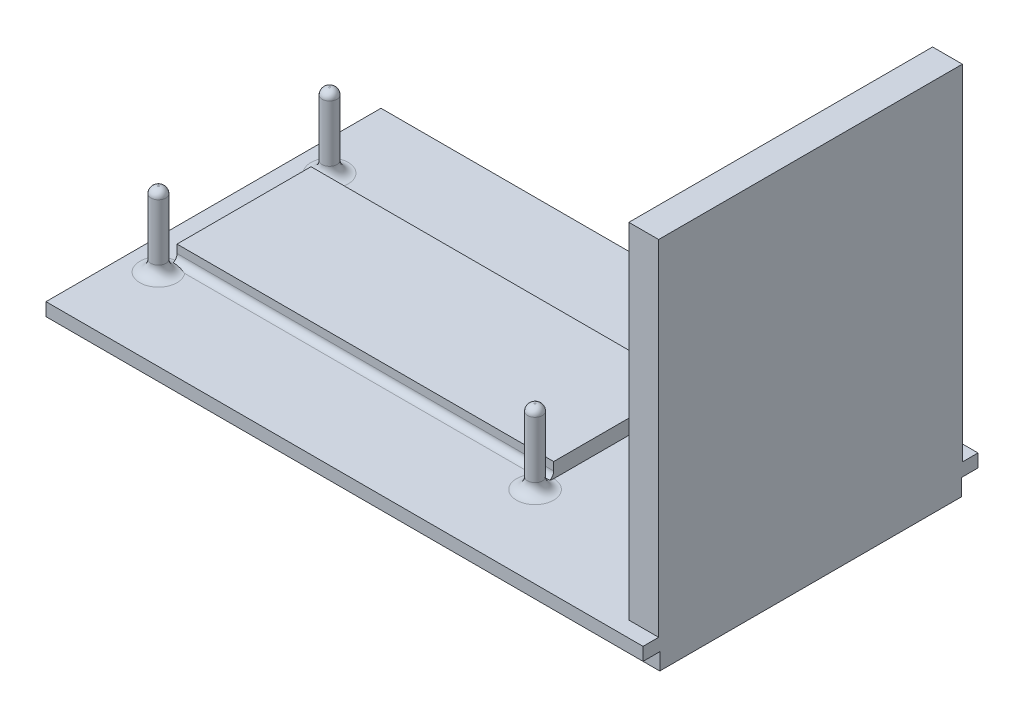
ISO-10303-21;
HEADER;
FILE_DESCRIPTION(('STEP AP214'),'2;1');
FILE_NAME('part.step','',(''),(''),'','','');
FILE_SCHEMA(('AUTOMOTIVE_DESIGN { 1 0 10303 214 1 1 1 1 }'));
ENDSEC;
DATA;
#1=APPLICATION_CONTEXT('core data for automotive mechanical design processes');
#2=APPLICATION_PROTOCOL_DEFINITION('international standard','automotive_design',2000,#1);
#3=PRODUCT_CONTEXT('',#1,'mechanical');
#4=PRODUCT('Part','Part','',(#3));
#5=PRODUCT_RELATED_PRODUCT_CATEGORY('part','',(#4));
#6=PRODUCT_DEFINITION_FORMATION('','',#4);
#7=PRODUCT_DEFINITION_CONTEXT('part definition',#1,'design');
#8=PRODUCT_DEFINITION('design','',#6,#7);
#9=PRODUCT_DEFINITION_SHAPE('','',#8);
#10=(LENGTH_UNIT() NAMED_UNIT(*) SI_UNIT(.MILLI.,.METRE.));
#11=(NAMED_UNIT(*) PLANE_ANGLE_UNIT() SI_UNIT($,.RADIAN.));
#12=(NAMED_UNIT(*) SI_UNIT($,.STERADIAN.) SOLID_ANGLE_UNIT());
#13=UNCERTAINTY_MEASURE_WITH_UNIT(LENGTH_MEASURE(1.E-05),#10,'distance_accuracy_value','');
#14=(GEOMETRIC_REPRESENTATION_CONTEXT(3) GLOBAL_UNCERTAINTY_ASSIGNED_CONTEXT((#13)) GLOBAL_UNIT_ASSIGNED_CONTEXT((#10,
#11,#12)) REPRESENTATION_CONTEXT('',''));
#15=CARTESIAN_POINT('',(0.,0.,0.));
#16=DIRECTION('',(0.,0.,1.));
#17=DIRECTION('',(1.,0.,0.));
#18=AXIS2_PLACEMENT_3D('',#15,#16,#17);
#19=CARTESIAN_POINT('',(80.2,3.99999999999999,0.));
#20=DIRECTION('',(0.,1.,0.));
#21=DIRECTION('',(0.,0.,1.));
#22=AXIS2_PLACEMENT_3D('',#19,#20,#21);
#23=PLANE('',#22);
#24=DIRECTION('',(1.,0.,0.));
#25=VECTOR('',#24,1.);
#26=CARTESIAN_POINT('',(76.2,4.,-2.1));
#27=LINE('',#26,#25);
#28=CARTESIAN_POINT('',(76.2,4.,-2.1));
#29=VERTEX_POINT('',#28);
#30=CARTESIAN_POINT('',(80.2,4.,-2.1));
#31=VERTEX_POINT('',#30);
#32=EDGE_CURVE('E243',#29,#31,#27,.T.);
#33=ORIENTED_EDGE('',*,*,#32,.F.);
#34=DIRECTION('',(0.,0.,-1.));
#35=VECTOR('',#34,1.);
#36=CARTESIAN_POINT('',(76.2,4.,-2.1));
#37=LINE('',#36,#35);
#38=CARTESIAN_POINT('',(76.2,3.99999999999999,-42.9));
#39=VERTEX_POINT('',#38);
#40=EDGE_CURVE('E237',#29,#39,#37,.T.);
#41=ORIENTED_EDGE('',*,*,#40,.T.);
#42=DIRECTION('',(1.,0.,0.));
#43=VECTOR('',#42,1.);
#44=CARTESIAN_POINT('',(76.2,3.99999999999999,-42.9));
#45=LINE('',#44,#43);
#46=CARTESIAN_POINT('',(80.2,4.,-42.9));
#47=VERTEX_POINT('',#46);
#48=EDGE_CURVE('E247',#39,#47,#45,.T.);
#49=ORIENTED_EDGE('',*,*,#48,.T.);
#50=DIRECTION('',(0.,0.,-1.));
#51=VECTOR('',#50,1.);
#52=CARTESIAN_POINT('',(80.2,3.99999999999999,0.));
#53=LINE('',#52,#51);
#54=CARTESIAN_POINT('',(80.2,4.,-45.));
#55=VERTEX_POINT('',#54);
#56=EDGE_CURVE('E276',#47,#55,#53,.T.);
#57=ORIENTED_EDGE('',*,*,#56,.T.);
#58=DIRECTION('',(-1.,0.,0.));
#59=VECTOR('',#58,1.);
#60=CARTESIAN_POINT('',(80.2,4.,-45.));
#61=LINE('',#60,#59);
#62=CARTESIAN_POINT('',(0.,4.,-45.));
#63=VERTEX_POINT('',#62);
#64=EDGE_CURVE('E302',#55,#63,#61,.T.);
#65=ORIENTED_EDGE('',*,*,#64,.T.);
#66=DIRECTION('',(0.,0.,-1.));
#67=VECTOR('',#66,1.);
#68=CARTESIAN_POINT('',(0.,3.99999999999999,0.));
#69=LINE('',#68,#67);
#70=CARTESIAN_POINT('',(0.,3.99999999999999,0.));
#71=VERTEX_POINT('',#70);
#72=EDGE_CURVE('E288',#71,#63,#69,.T.);
#73=ORIENTED_EDGE('',*,*,#72,.F.);
#74=DIRECTION('',(-1.,0.,0.));
#75=VECTOR('',#74,1.);
#76=CARTESIAN_POINT('',(80.2,3.99999999999999,0.));
#77=LINE('',#76,#75);
#78=CARTESIAN_POINT('',(80.2,3.99999999999999,0.));
#79=VERTEX_POINT('',#78);
#80=EDGE_CURVE('E300',#79,#71,#77,.T.);
#81=ORIENTED_EDGE('',*,*,#80,.F.);
#82=EDGE_CURVE('E277',#79,#31,#53,.T.);
#83=ORIENTED_EDGE('',*,*,#82,.T.);
#84=EDGE_LOOP('',(#33,#41,#49,#57,#65,#73,#81,#83));
#85=FACE_BOUND('',#84,.T.);
#86=CARTESIAN_POINT('',(4.10000000000001,4.,-34.));
#87=DIRECTION('',(0.,1.,0.));
#88=DIRECTION('',(0.,0.,1.));
#89=AXIS2_PLACEMENT_3D('',#86,#87,#88);
#90=CIRCLE('',#89,2.5);
#91=CARTESIAN_POINT('',(4.10000000000001,4.,-31.5));
#92=VERTEX_POINT('',#91);
#93=CARTESIAN_POINT('',(6.02093727122986,4.,-32.4));
#94=VERTEX_POINT('',#93);
#95=EDGE_CURVE('E327',#92,#94,#90,.F.);
#96=ORIENTED_EDGE('',*,*,#95,.T.);
#97=DIRECTION('',(-1.,0.,0.));
#98=VECTOR('',#97,1.);
#99=CARTESIAN_POINT('',(80.2,4.,-32.4));
#100=LINE('',#99,#98);
#101=CARTESIAN_POINT('',(52.7790627287702,4.,-32.4));
#102=VERTEX_POINT('',#101);
#103=EDGE_CURVE('E404',#94,#102,#100,.F.);
#104=ORIENTED_EDGE('',*,*,#103,.T.);
#105=CARTESIAN_POINT('',(54.7,4.,-34.));
#106=DIRECTION('',(0.,1.,0.));
#107=DIRECTION('',(0.,0.,1.));
#108=AXIS2_PLACEMENT_3D('',#105,#106,#107);
#109=CIRCLE('',#108,2.5);
#110=CARTESIAN_POINT('',(54.7,4.,-31.5));
#111=VERTEX_POINT('',#110);
#112=EDGE_CURVE('E324',#102,#111,#109,.F.);
#113=ORIENTED_EDGE('',*,*,#112,.T.);
#114=DIRECTION('',(0.,0.,-1.));
#115=VECTOR('',#114,1.);
#116=CARTESIAN_POINT('',(54.7,4.,-31.5));
#117=LINE('',#116,#115);
#118=CARTESIAN_POINT('',(54.7,3.99999999999999,-13.5));
#119=VERTEX_POINT('',#118);
#120=EDGE_CURVE('E212',#119,#111,#117,.T.);
#121=ORIENTED_EDGE('',*,*,#120,.F.);
#122=CARTESIAN_POINT('',(54.7,3.99999999999999,-11.));
#123=DIRECTION('',(0.,1.,0.));
#124=DIRECTION('',(0.,0.,1.));
#125=AXIS2_PLACEMENT_3D('',#122,#123,#124);
#126=CIRCLE('',#125,2.5);
#127=CARTESIAN_POINT('',(52.7790627287701,3.99999999999999,-12.6));
#128=VERTEX_POINT('',#127);
#129=EDGE_CURVE('E321',#119,#128,#126,.F.);
#130=ORIENTED_EDGE('',*,*,#129,.T.);
#131=DIRECTION('',(1.,0.,0.));
#132=VECTOR('',#131,1.);
#133=CARTESIAN_POINT('',(80.2,3.99999999999999,-12.6));
#134=LINE('',#133,#132);
#135=CARTESIAN_POINT('',(6.02093727122986,3.99999999999999,-12.6));
#136=VERTEX_POINT('',#135);
#137=EDGE_CURVE('E787',#128,#136,#134,.F.);
#138=ORIENTED_EDGE('',*,*,#137,.T.);
#139=CARTESIAN_POINT('',(4.10000000000001,3.99999999999999,-11.));
#140=DIRECTION('',(0.,1.,0.));
#141=DIRECTION('',(0.,0.,1.));
#142=AXIS2_PLACEMENT_3D('',#139,#140,#141);
#143=CIRCLE('',#142,2.5);
#144=CARTESIAN_POINT('',(4.10000000000001,3.99999999999999,-13.5));
#145=VERTEX_POINT('',#144);
#146=EDGE_CURVE('E318',#136,#145,#143,.F.);
#147=ORIENTED_EDGE('',*,*,#146,.T.);
#148=DIRECTION('',(0.,0.,1.));
#149=VECTOR('',#148,1.);
#150=CARTESIAN_POINT('',(4.10000000000001,4.,-31.5));
#151=LINE('',#150,#149);
#152=EDGE_CURVE('E791',#92,#145,#151,.T.);
#153=ORIENTED_EDGE('',*,*,#152,.F.);
#154=EDGE_LOOP('',(#96,#104,#113,#121,#130,#138,#147,#153));
#155=FACE_BOUND('',#154,.T.);
#156=ADVANCED_FACE('F41',(#85,#155),#23,.T.);
#157=CARTESIAN_POINT('',(80.2,0.,-2.25));
#158=DIRECTION('',(0.,0.,1.));
#159=DIRECTION('',(0.,-1.,0.));
#160=AXIS2_PLACEMENT_3D('',#157,#158,#159);
#161=PLANE('',#160);
#162=DIRECTION('',(0.,1.,0.));
#163=VECTOR('',#162,1.);
#164=CARTESIAN_POINT('',(2.1,1.50969129173204E-13,-2.25));
#165=LINE('',#164,#163);
#166=CARTESIAN_POINT('',(2.1,0.,-2.25000000000002));
#167=VERTEX_POINT('',#166);
#168=CARTESIAN_POINT('',(2.1,2.25,-2.25000000000002));
#169=VERTEX_POINT('',#168);
#170=EDGE_CURVE('E259',#167,#169,#165,.T.);
#171=ORIENTED_EDGE('',*,*,#170,.F.);
#172=DIRECTION('',(-1.,0.,0.));
#173=VECTOR('',#172,1.);
#174=CARTESIAN_POINT('',(80.2,0.,-2.25));
#175=LINE('',#174,#173);
#176=CARTESIAN_POINT('',(80.2,0.,-2.25));
#177=VERTEX_POINT('',#176);
#178=EDGE_CURVE('E312',#177,#167,#175,.T.);
#179=ORIENTED_EDGE('',*,*,#178,.F.);
#180=DIRECTION('',(0.,1.,0.));
#181=VECTOR('',#180,1.);
#182=CARTESIAN_POINT('',(80.2,0.,-2.25));
#183=LINE('',#182,#181);
#184=CARTESIAN_POINT('',(80.2,2.25,-2.25));
#185=VERTEX_POINT('',#184);
#186=EDGE_CURVE('E262',#177,#185,#183,.T.);
#187=ORIENTED_EDGE('',*,*,#186,.T.);
#188=DIRECTION('',(-1.,0.,0.));
#189=VECTOR('',#188,1.);
#190=CARTESIAN_POINT('',(80.2,2.25,-2.25));
#191=LINE('',#190,#189);
#192=EDGE_CURVE('E285',#185,#169,#191,.T.);
#193=ORIENTED_EDGE('',*,*,#192,.T.);
#194=EDGE_LOOP('',(#171,#179,#187,#193));
#195=FACE_BOUND('',#194,.T.);
#196=ADVANCED_FACE('F385',(#195),#161,.T.);
#197=CARTESIAN_POINT('',(80.2,0.,0.));
#198=DIRECTION('',(0.,1.,0.));
#199=DIRECTION('',(0.,0.,1.));
#200=AXIS2_PLACEMENT_3D('',#197,#198,#199);
#201=PLANE('',#200);
#202=ORIENTED_EDGE('',*,*,#178,.T.);
#203=DIRECTION('',(0.,0.,1.));
#204=VECTOR('',#203,1.);
#205=CARTESIAN_POINT('',(2.1,0.,-45.));
#206=LINE('',#205,#204);
#207=CARTESIAN_POINT('',(2.1,0.,-42.75));
#208=VERTEX_POINT('',#207);
#209=EDGE_CURVE('E250',#208,#167,#206,.T.);
#210=ORIENTED_EDGE('',*,*,#209,.F.);
#211=DIRECTION('',(-1.,0.,0.));
#212=VECTOR('',#211,1.);
#213=CARTESIAN_POINT('',(80.2,0.,-42.75));
#214=LINE('',#213,#212);
#215=CARTESIAN_POINT('',(80.2,0.,-42.75));
#216=VERTEX_POINT('',#215);
#217=EDGE_CURVE('E309',#216,#208,#214,.T.);
#218=ORIENTED_EDGE('',*,*,#217,.F.);
#219=DIRECTION('',(0.,0.,-1.));
#220=VECTOR('',#219,1.);
#221=CARTESIAN_POINT('',(80.2,0.,0.));
#222=LINE('',#221,#220);
#223=EDGE_CURVE('E265',#177,#216,#222,.T.);
#224=ORIENTED_EDGE('',*,*,#223,.F.);
#225=EDGE_LOOP('',(#202,#210,#218,#224));
#226=FACE_BOUND('',#225,.T.);
#227=ADVANCED_FACE('F456',(#226),#201,.F.);
#228=CARTESIAN_POINT('',(80.2,0.,-42.75));
#229=DIRECTION('',(0.,0.,1.));
#230=DIRECTION('',(1.,0.,0.));
#231=AXIS2_PLACEMENT_3D('',#228,#229,#230);
#232=PLANE('',#231);
#233=ORIENTED_EDGE('',*,*,#217,.T.);
#234=DIRECTION('',(0.,1.,0.));
#235=VECTOR('',#234,1.);
#236=CARTESIAN_POINT('',(2.1,1.5053544830421E-13,-42.75));
#237=LINE('',#236,#235);
#238=CARTESIAN_POINT('',(2.1,2.25,-42.75));
#239=VERTEX_POINT('',#238);
#240=EDGE_CURVE('E255',#208,#239,#237,.T.);
#241=ORIENTED_EDGE('',*,*,#240,.T.);
#242=DIRECTION('',(-1.,0.,0.));
#243=VECTOR('',#242,1.);
#244=CARTESIAN_POINT('',(80.2,2.25,-42.75));
#245=LINE('',#244,#243);
#246=CARTESIAN_POINT('',(80.2,2.25,-42.75));
#247=VERTEX_POINT('',#246);
#248=EDGE_CURVE('E306',#247,#239,#245,.T.);
#249=ORIENTED_EDGE('',*,*,#248,.F.);
#250=DIRECTION('',(0.,1.,0.));
#251=VECTOR('',#250,1.);
#252=CARTESIAN_POINT('',(80.2,0.,-42.75));
#253=LINE('',#252,#251);
#254=EDGE_CURVE('E268',#216,#247,#253,.T.);
#255=ORIENTED_EDGE('',*,*,#254,.F.);
#256=EDGE_LOOP('',(#233,#241,#249,#255));
#257=FACE_BOUND('',#256,.T.);
#258=ADVANCED_FACE('F467',(#257),#232,.F.);
#259=CARTESIAN_POINT('',(80.2,0.,-45.));
#260=DIRECTION('',(0.,0.,1.));
#261=DIRECTION('',(1.,0.,0.));
#262=AXIS2_PLACEMENT_3D('',#259,#260,#261);
#263=PLANE('',#262);
#264=DIRECTION('',(0.,1.,0.));
#265=VECTOR('',#264,1.);
#266=CARTESIAN_POINT('',(0.,0.,-45.));
#267=LINE('',#266,#265);
#268=CARTESIAN_POINT('',(0.,2.25,-45.));
#269=VERTEX_POINT('',#268);
#270=EDGE_CURVE('E261',#269,#63,#267,.T.);
#271=ORIENTED_EDGE('',*,*,#270,.T.);
#272=ORIENTED_EDGE('',*,*,#64,.F.);
#273=DIRECTION('',(0.,1.,0.));
#274=VECTOR('',#273,1.);
#275=CARTESIAN_POINT('',(80.2,0.,-45.));
#276=LINE('',#275,#274);
#277=CARTESIAN_POINT('',(80.2,2.25,-45.));
#278=VERTEX_POINT('',#277);
#279=EDGE_CURVE('E273',#278,#55,#276,.T.);
#280=ORIENTED_EDGE('',*,*,#279,.F.);
#281=DIRECTION('',(-1.,0.,0.));
#282=VECTOR('',#281,1.);
#283=CARTESIAN_POINT('',(80.2,2.25,-45.));
#284=LINE('',#283,#282);
#285=EDGE_CURVE('E304',#278,#269,#284,.T.);
#286=ORIENTED_EDGE('',*,*,#285,.T.);
#287=EDGE_LOOP('',(#271,#272,#280,#286));
#288=FACE_BOUND('',#287,.T.);
#289=ADVANCED_FACE('F464',(#288),#263,.F.);
#290=CARTESIAN_POINT('',(80.2,0.,0.));
#291=DIRECTION('',(0.,0.,1.));
#292=DIRECTION('',(0.,-1.,0.));
#293=AXIS2_PLACEMENT_3D('',#290,#291,#292);
#294=PLANE('',#293);
#295=DIRECTION('',(0.,1.,0.));
#296=VECTOR('',#295,1.);
#297=CARTESIAN_POINT('',(0.,0.,0.));
#298=LINE('',#297,#296);
#299=CARTESIAN_POINT('',(0.,2.25,0.));
#300=VERTEX_POINT('',#299);
#301=EDGE_CURVE('E291',#300,#71,#298,.T.);
#302=ORIENTED_EDGE('',*,*,#301,.F.);
#303=DIRECTION('',(-1.,0.,0.));
#304=VECTOR('',#303,1.);
#305=CARTESIAN_POINT('',(80.2,2.25,0.));
#306=LINE('',#305,#304);
#307=CARTESIAN_POINT('',(80.2,2.25,0.));
#308=VERTEX_POINT('',#307);
#309=EDGE_CURVE('E298',#308,#300,#306,.T.);
#310=ORIENTED_EDGE('',*,*,#309,.F.);
#311=DIRECTION('',(0.,1.,0.));
#312=VECTOR('',#311,1.);
#313=CARTESIAN_POINT('',(80.2,0.,0.));
#314=LINE('',#313,#312);
#315=EDGE_CURVE('E280',#308,#79,#314,.T.);
#316=ORIENTED_EDGE('',*,*,#315,.T.);
#317=ORIENTED_EDGE('',*,*,#80,.T.);
#318=EDGE_LOOP('',(#302,#310,#316,#317));
#319=FACE_BOUND('',#318,.T.);
#320=ADVANCED_FACE('F462',(#319),#294,.T.);
#321=CARTESIAN_POINT('',(80.2,2.25,0.));
#322=DIRECTION('',(0.,1.,0.));
#323=DIRECTION('',(0.,0.,1.));
#324=AXIS2_PLACEMENT_3D('',#321,#322,#323);
#325=PLANE('',#324);
#326=ORIENTED_EDGE('',*,*,#309,.T.);
#327=DIRECTION('',(0.,0.,-1.));
#328=VECTOR('',#327,1.);
#329=CARTESIAN_POINT('',(0.,2.25,0.));
#330=LINE('',#329,#328);
#331=EDGE_CURVE('E266',#300,#269,#330,.T.);
#332=ORIENTED_EDGE('',*,*,#331,.T.);
#333=ORIENTED_EDGE('',*,*,#285,.F.);
#334=DIRECTION('',(0.,0.,1.));
#335=VECTOR('',#334,1.);
#336=CARTESIAN_POINT('',(80.2,2.24999999999999,0.));
#337=LINE('',#336,#335);
#338=EDGE_CURVE('E270',#278,#247,#337,.T.);
#339=ORIENTED_EDGE('',*,*,#338,.T.);
#340=ORIENTED_EDGE('',*,*,#248,.T.);
#341=DIRECTION('',(0.,0.,1.));
#342=VECTOR('',#341,1.);
#343=CARTESIAN_POINT('',(2.1,2.25,-45.));
#344=LINE('',#343,#342);
#345=EDGE_CURVE('E252',#239,#169,#344,.T.);
#346=ORIENTED_EDGE('',*,*,#345,.T.);
#347=ORIENTED_EDGE('',*,*,#192,.F.);
#348=DIRECTION('',(0.,0.,-1.));
#349=VECTOR('',#348,1.);
#350=CARTESIAN_POINT('',(80.2,2.25,0.));
#351=LINE('',#350,#349);
#352=EDGE_CURVE('E283',#308,#185,#351,.T.);
#353=ORIENTED_EDGE('',*,*,#352,.F.);
#354=EDGE_LOOP('',(#326,#332,#333,#339,#340,#346,#347,#353));
#355=FACE_BOUND('',#354,.T.);
#356=ADVANCED_FACE('F484',(#355),#325,.F.);
#357=CARTESIAN_POINT('',(80.2,0.,0.));
#358=DIRECTION('',(1.,0.,0.));
#359=DIRECTION('',(0.,0.,-1.));
#360=AXIS2_PLACEMENT_3D('',#357,#358,#359);
#361=PLANE('',#360);
#362=ORIENTED_EDGE('',*,*,#186,.F.);
#363=ORIENTED_EDGE('',*,*,#223,.T.);
#364=ORIENTED_EDGE('',*,*,#254,.T.);
#365=ORIENTED_EDGE('',*,*,#338,.F.);
#366=ORIENTED_EDGE('',*,*,#279,.T.);
#367=ORIENTED_EDGE('',*,*,#56,.F.);
#368=DIRECTION('',(0.,1.,0.));
#369=VECTOR('',#368,1.);
#370=CARTESIAN_POINT('',(80.2,3.99999999999999,-42.9));
#371=LINE('',#370,#369);
#372=CARTESIAN_POINT('',(80.2,50.28,-42.9));
#373=VERTEX_POINT('',#372);
#374=EDGE_CURVE('E238',#47,#373,#371,.T.);
#375=ORIENTED_EDGE('',*,*,#374,.T.);
#376=DIRECTION('',(0.,0.,-1.));
#377=VECTOR('',#376,1.);
#378=CARTESIAN_POINT('',(80.2,50.28,-42.9));
#379=LINE('',#378,#377);
#380=CARTESIAN_POINT('',(80.2,50.28,-2.1));
#381=VERTEX_POINT('',#380);
#382=EDGE_CURVE('E227',#381,#373,#379,.T.);
#383=ORIENTED_EDGE('',*,*,#382,.F.);
#384=DIRECTION('',(0.,-1.,0.));
#385=VECTOR('',#384,1.);
#386=CARTESIAN_POINT('',(80.2,4.,-2.1));
#387=LINE('',#386,#385);
#388=EDGE_CURVE('E233',#381,#31,#387,.T.);
#389=ORIENTED_EDGE('',*,*,#388,.T.);
#390=ORIENTED_EDGE('',*,*,#82,.F.);
#391=ORIENTED_EDGE('',*,*,#315,.F.);
#392=ORIENTED_EDGE('',*,*,#352,.T.);
#393=EDGE_LOOP('',(#362,#363,#364,#365,#366,#367,#375,#383,#389,#390,#391,#392));
#394=FACE_BOUND('',#393,.T.);
#395=ADVANCED_FACE('F490',(#394),#361,.T.);
#396=CARTESIAN_POINT('',(0.,0.,0.));
#397=DIRECTION('',(1.,0.,0.));
#398=DIRECTION('',(0.,0.,-1.));
#399=AXIS2_PLACEMENT_3D('',#396,#397,#398);
#400=PLANE('',#399);
#401=ORIENTED_EDGE('',*,*,#270,.F.);
#402=ORIENTED_EDGE('',*,*,#331,.F.);
#403=ORIENTED_EDGE('',*,*,#301,.T.);
#404=ORIENTED_EDGE('',*,*,#72,.T.);
#405=EDGE_LOOP('',(#401,#402,#403,#404));
#406=FACE_BOUND('',#405,.T.);
#407=ADVANCED_FACE('F498',(#406),#400,.F.);
#408=CARTESIAN_POINT('',(2.1,0.,-45.));
#409=DIRECTION('',(1.,0.,0.));
#410=DIRECTION('',(0.,1.,0.));
#411=AXIS2_PLACEMENT_3D('',#408,#409,#410);
#412=PLANE('',#411);
#413=ORIENTED_EDGE('',*,*,#170,.T.);
#414=ORIENTED_EDGE('',*,*,#345,.F.);
#415=ORIENTED_EDGE('',*,*,#240,.F.);
#416=ORIENTED_EDGE('',*,*,#209,.T.);
#417=EDGE_LOOP('',(#413,#414,#415,#416));
#418=FACE_BOUND('',#417,.T.);
#419=ADVANCED_FACE('F482',(#418),#412,.F.);
#420=CARTESIAN_POINT('',(76.2,4.,-2.1));
#421=DIRECTION('',(0.,0.,1.));
#422=DIRECTION('',(1.,0.,0.));
#423=AXIS2_PLACEMENT_3D('',#420,#421,#422);
#424=PLANE('',#423);
#425=ORIENTED_EDGE('',*,*,#388,.F.);
#426=DIRECTION('',(1.,0.,0.));
#427=VECTOR('',#426,1.);
#428=CARTESIAN_POINT('',(76.2,50.28,-2.1));
#429=LINE('',#428,#427);
#430=CARTESIAN_POINT('',(76.2,50.28,-2.1));
#431=VERTEX_POINT('',#430);
#432=EDGE_CURVE('E219',#431,#381,#429,.T.);
#433=ORIENTED_EDGE('',*,*,#432,.F.);
#434=DIRECTION('',(0.,-1.,0.));
#435=VECTOR('',#434,1.);
#436=CARTESIAN_POINT('',(76.2,4.,-2.1));
#437=LINE('',#436,#435);
#438=EDGE_CURVE('E234',#431,#29,#437,.T.);
#439=ORIENTED_EDGE('',*,*,#438,.T.);
#440=ORIENTED_EDGE('',*,*,#32,.T.);
#441=EDGE_LOOP('',(#425,#433,#439,#440));
#442=FACE_BOUND('',#441,.T.);
#443=ADVANCED_FACE('F515',(#442),#424,.T.);
#444=CARTESIAN_POINT('',(76.2,3.99999999999999,-42.9));
#445=DIRECTION('',(0.,0.,-1.));
#446=DIRECTION('',(-1.,0.,0.));
#447=AXIS2_PLACEMENT_3D('',#444,#445,#446);
#448=PLANE('',#447);
#449=ORIENTED_EDGE('',*,*,#374,.F.);
#450=ORIENTED_EDGE('',*,*,#48,.F.);
#451=DIRECTION('',(0.,1.,0.));
#452=VECTOR('',#451,1.);
#453=CARTESIAN_POINT('',(76.2,3.99999999999999,-42.9));
#454=LINE('',#453,#452);
#455=CARTESIAN_POINT('',(76.2,50.28,-42.9));
#456=VERTEX_POINT('',#455);
#457=EDGE_CURVE('E241',#39,#456,#454,.T.);
#458=ORIENTED_EDGE('',*,*,#457,.T.);
#459=DIRECTION('',(-1.,0.,0.));
#460=VECTOR('',#459,1.);
#461=CARTESIAN_POINT('',(76.2,50.28,-42.9));
#462=LINE('',#461,#460);
#463=EDGE_CURVE('E230',#373,#456,#462,.T.);
#464=ORIENTED_EDGE('',*,*,#463,.F.);
#465=EDGE_LOOP('',(#449,#450,#458,#464));
#466=FACE_BOUND('',#465,.T.);
#467=ADVANCED_FACE('F510',(#466),#448,.T.);
#468=CARTESIAN_POINT('',(76.2,0.,0.));
#469=DIRECTION('',(-1.,0.,0.));
#470=DIRECTION('',(0.,0.,1.));
#471=AXIS2_PLACEMENT_3D('',#468,#469,#470);
#472=PLANE('',#471);
#473=ORIENTED_EDGE('',*,*,#438,.F.);
#474=DIRECTION('',(0.,0.,1.));
#475=VECTOR('',#474,1.);
#476=CARTESIAN_POINT('',(76.2,50.28,-42.9));
#477=LINE('',#476,#475);
#478=EDGE_CURVE('E216',#456,#431,#477,.T.);
#479=ORIENTED_EDGE('',*,*,#478,.F.);
#480=ORIENTED_EDGE('',*,*,#457,.F.);
#481=ORIENTED_EDGE('',*,*,#40,.F.);
#482=EDGE_LOOP('',(#473,#479,#480,#481));
#483=FACE_BOUND('',#482,.T.);
#484=ADVANCED_FACE('F513',(#483),#472,.T.);
#485=CARTESIAN_POINT('',(0.,50.28,0.));
#486=DIRECTION('',(0.,1.,0.));
#487=DIRECTION('',(0.,0.,1.));
#488=AXIS2_PLACEMENT_3D('',#485,#486,#487);
#489=PLANE('',#488);
#490=ORIENTED_EDGE('',*,*,#478,.T.);
#491=ORIENTED_EDGE('',*,*,#432,.T.);
#492=ORIENTED_EDGE('',*,*,#382,.T.);
#493=ORIENTED_EDGE('',*,*,#463,.T.);
#494=EDGE_LOOP('',(#490,#491,#492,#493));
#495=FACE_BOUND('',#494,.T.);
#496=ADVANCED_FACE('F507',(#495),#489,.T.);
#497=CARTESIAN_POINT('',(4.10000000000001,14.,-34.));
#498=DIRECTION('',(0.,-1.,0.));
#499=DIRECTION('',(0.,0.,-1.));
#500=AXIS2_PLACEMENT_3D('',#497,#498,#499);
#501=CYLINDRICAL_SURFACE('',#500,1.);
#502=CARTESIAN_POINT('',(4.10000000000001,13.1,-34.));
#503=DIRECTION('',(0.,1.,0.));
#504=DIRECTION('',(0.,0.,1.));
#505=AXIS2_PLACEMENT_3D('',#502,#503,#504);
#506=CIRCLE('',#505,1.);
#507=CARTESIAN_POINT('',(4.10000000000001,13.1,-33.));
#508=VERTEX_POINT('',#507);
#509=EDGE_CURVE('E354',#508,#508,#506,.F.);
#510=ORIENTED_EDGE('',*,*,#509,.T.);
#511=EDGE_LOOP('',(#510));
#512=FACE_BOUND('',#511,.T.);
#513=CARTESIAN_POINT('',(4.10000000000001,5.5,-34.));
#514=DIRECTION('',(0.,1.,0.));
#515=DIRECTION('',(0.,0.,1.));
#516=AXIS2_PLACEMENT_3D('',#513,#514,#515);
#517=CIRCLE('',#516,1.);
#518=CARTESIAN_POINT('',(4.10000000000001,5.5,-33.));
#519=VERTEX_POINT('',#518);
#520=EDGE_CURVE('E315',#519,#519,#517,.T.);
#521=ORIENTED_EDGE('',*,*,#520,.T.);
#522=EDGE_LOOP('',(#521));
#523=FACE_BOUND('',#522,.T.);
#524=ADVANCED_FACE('F607',(#512,#523),#501,.T.);
#525=CARTESIAN_POINT('',(4.10000000000001,14.,-34.));
#526=DIRECTION('',(0.,1.,0.));
#527=DIRECTION('',(0.,0.,1.));
#528=AXIS2_PLACEMENT_3D('',#525,#526,#527);
#529=PLANE('',#528);
#530=CARTESIAN_POINT('',(4.10000000000001,14.,-34.));
#531=DIRECTION('',(0.,1.,0.));
#532=DIRECTION('',(0.,0.,1.));
#533=AXIS2_PLACEMENT_3D('',#530,#531,#532);
#534=CIRCLE('',#533,0.1);
#535=CARTESIAN_POINT('',(4.10000000000001,14.,-33.9));
#536=VERTEX_POINT('',#535);
#537=EDGE_CURVE('E351',#536,#536,#534,.T.);
#538=ORIENTED_EDGE('',*,*,#537,.T.);
#539=EDGE_LOOP('',(#538));
#540=FACE_BOUND('',#539,.T.);
#541=ADVANCED_FACE('F615',(#540),#529,.T.);
#542=CARTESIAN_POINT('',(4.10000000000001,14.,-11.));
#543=DIRECTION('',(0.,-1.,0.));
#544=DIRECTION('',(0.,0.,-1.));
#545=AXIS2_PLACEMENT_3D('',#542,#543,#544);
#546=CYLINDRICAL_SURFACE('',#545,1.);
#547=CARTESIAN_POINT('',(4.10000000000001,13.1,-11.));
#548=DIRECTION('',(0.,1.,0.));
#549=DIRECTION('',(0.,0.,1.));
#550=AXIS2_PLACEMENT_3D('',#547,#548,#549);
#551=CIRCLE('',#550,1.);
#552=CARTESIAN_POINT('',(4.10000000000001,13.1,-10.));
#553=VERTEX_POINT('',#552);
#554=EDGE_CURVE('E360',#553,#553,#551,.F.);
#555=ORIENTED_EDGE('',*,*,#554,.T.);
#556=EDGE_LOOP('',(#555));
#557=FACE_BOUND('',#556,.T.);
#558=CARTESIAN_POINT('',(4.10000000000001,5.49999999999999,-11.));
#559=DIRECTION('',(0.,1.,0.));
#560=DIRECTION('',(0.,0.,1.));
#561=AXIS2_PLACEMENT_3D('',#558,#559,#560);
#562=CIRCLE('',#561,1.);
#563=CARTESIAN_POINT('',(4.10000000000001,5.49999999999999,-10.));
#564=VERTEX_POINT('',#563);
#565=EDGE_CURVE('E336',#564,#564,#562,.T.);
#566=ORIENTED_EDGE('',*,*,#565,.T.);
#567=EDGE_LOOP('',(#566));
#568=FACE_BOUND('',#567,.T.);
#569=ADVANCED_FACE('F624',(#557,#568),#546,.T.);
#570=CARTESIAN_POINT('',(4.10000000000001,14.,-11.));
#571=DIRECTION('',(0.,1.,0.));
#572=DIRECTION('',(0.,0.,1.));
#573=AXIS2_PLACEMENT_3D('',#570,#571,#572);
#574=PLANE('',#573);
#575=CARTESIAN_POINT('',(4.10000000000001,14.,-11.));
#576=DIRECTION('',(0.,1.,0.));
#577=DIRECTION('',(0.,0.,1.));
#578=AXIS2_PLACEMENT_3D('',#575,#576,#577);
#579=CIRCLE('',#578,0.1);
#580=CARTESIAN_POINT('',(4.10000000000001,14.,-10.9));
#581=VERTEX_POINT('',#580);
#582=EDGE_CURVE('E357',#581,#581,#579,.T.);
#583=ORIENTED_EDGE('',*,*,#582,.T.);
#584=EDGE_LOOP('',(#583));
#585=FACE_BOUND('',#584,.T.);
#586=ADVANCED_FACE('F633',(#585),#574,.T.);
#587=CARTESIAN_POINT('',(54.7,14.,-11.));
#588=DIRECTION('',(0.,-1.,0.));
#589=DIRECTION('',(0.,0.,-1.));
#590=AXIS2_PLACEMENT_3D('',#587,#588,#589);
#591=CYLINDRICAL_SURFACE('',#590,0.999999999999998);
#592=CARTESIAN_POINT('',(54.7,13.1,-11.));
#593=DIRECTION('',(0.,1.,0.));
#594=DIRECTION('',(0.,0.,1.));
#595=AXIS2_PLACEMENT_3D('',#592,#593,#594);
#596=CIRCLE('',#595,0.999999999999998);
#597=CARTESIAN_POINT('',(54.7,13.1,-10.));
#598=VERTEX_POINT('',#597);
#599=EDGE_CURVE('E342',#598,#598,#596,.F.);
#600=ORIENTED_EDGE('',*,*,#599,.T.);
#601=EDGE_LOOP('',(#600));
#602=FACE_BOUND('',#601,.T.);
#603=CARTESIAN_POINT('',(54.7,5.49999999999999,-11.));
#604=DIRECTION('',(0.,1.,0.));
#605=DIRECTION('',(0.,0.,1.));
#606=AXIS2_PLACEMENT_3D('',#603,#604,#605);
#607=CIRCLE('',#606,0.999999999999998);
#608=CARTESIAN_POINT('',(54.7,5.49999999999999,-10.));
#609=VERTEX_POINT('',#608);
#610=EDGE_CURVE('E333',#609,#609,#607,.T.);
#611=ORIENTED_EDGE('',*,*,#610,.T.);
#612=EDGE_LOOP('',(#611));
#613=FACE_BOUND('',#612,.T.);
#614=ADVANCED_FACE('F642',(#602,#613),#591,.T.);
#615=CARTESIAN_POINT('',(54.7,14.,-11.));
#616=DIRECTION('',(0.,1.,0.));
#617=DIRECTION('',(0.,0.,1.));
#618=AXIS2_PLACEMENT_3D('',#615,#616,#617);
#619=PLANE('',#618);
#620=CARTESIAN_POINT('',(54.7,14.,-11.));
#621=DIRECTION('',(0.,1.,0.));
#622=DIRECTION('',(0.,0.,1.));
#623=AXIS2_PLACEMENT_3D('',#620,#621,#622);
#624=CIRCLE('',#623,0.0999999999999983);
#625=CARTESIAN_POINT('',(54.7,14.,-10.9));
#626=VERTEX_POINT('',#625);
#627=EDGE_CURVE('E339',#626,#626,#624,.T.);
#628=ORIENTED_EDGE('',*,*,#627,.T.);
#629=EDGE_LOOP('',(#628));
#630=FACE_BOUND('',#629,.T.);
#631=ADVANCED_FACE('F651',(#630),#619,.T.);
#632=CARTESIAN_POINT('',(54.7,14.,-34.));
#633=DIRECTION('',(0.,-1.,0.));
#634=DIRECTION('',(0.,0.,-1.));
#635=AXIS2_PLACEMENT_3D('',#632,#633,#634);
#636=CYLINDRICAL_SURFACE('',#635,0.999999999999998);
#637=CARTESIAN_POINT('',(54.7,13.1,-34.));
#638=DIRECTION('',(0.,1.,0.));
#639=DIRECTION('',(0.,0.,1.));
#640=AXIS2_PLACEMENT_3D('',#637,#638,#639);
#641=CIRCLE('',#640,0.999999999999998);
#642=CARTESIAN_POINT('',(54.7,13.1,-33.));
#643=VERTEX_POINT('',#642);
#644=EDGE_CURVE('E348',#643,#643,#641,.F.);
#645=ORIENTED_EDGE('',*,*,#644,.T.);
#646=EDGE_LOOP('',(#645));
#647=FACE_BOUND('',#646,.T.);
#648=CARTESIAN_POINT('',(54.7,5.5,-34.));
#649=DIRECTION('',(0.,1.,0.));
#650=DIRECTION('',(0.,0.,1.));
#651=AXIS2_PLACEMENT_3D('',#648,#649,#650);
#652=CIRCLE('',#651,0.999999999999998);
#653=CARTESIAN_POINT('',(54.7,5.5,-33.));
#654=VERTEX_POINT('',#653);
#655=EDGE_CURVE('E330',#654,#654,#652,.T.);
#656=ORIENTED_EDGE('',*,*,#655,.T.);
#657=EDGE_LOOP('',(#656));
#658=FACE_BOUND('',#657,.T.);
#659=ADVANCED_FACE('F660',(#647,#658),#636,.T.);
#660=CARTESIAN_POINT('',(54.7,14.,-34.));
#661=DIRECTION('',(0.,1.,0.));
#662=DIRECTION('',(0.,0.,1.));
#663=AXIS2_PLACEMENT_3D('',#660,#661,#662);
#664=PLANE('',#663);
#665=CARTESIAN_POINT('',(54.7,14.,-34.));
#666=DIRECTION('',(0.,1.,0.));
#667=DIRECTION('',(0.,0.,1.));
#668=AXIS2_PLACEMENT_3D('',#665,#666,#667);
#669=CIRCLE('',#668,0.0999999999999983);
#670=CARTESIAN_POINT('',(54.7,14.,-33.9));
#671=VERTEX_POINT('',#670);
#672=EDGE_CURVE('E345',#671,#671,#669,.T.);
#673=ORIENTED_EDGE('',*,*,#672,.T.);
#674=EDGE_LOOP('',(#673));
#675=FACE_BOUND('',#674,.T.);
#676=ADVANCED_FACE('F383',(#675),#664,.T.);
#677=CARTESIAN_POINT('',(4.10000000000001,5.5,-34.));
#678=DIRECTION('',(0.,1.,0.));
#679=DIRECTION('',(0.,0.,1.));
#680=AXIS2_PLACEMENT_3D('',#677,#678,#679);
#681=TOROIDAL_SURFACE('',#680,2.5,1.5);
#682=ORIENTED_EDGE('',*,*,#95,.F.);
#683=CARTESIAN_POINT('',(4.10000000000001,5.5,-31.5));
#684=DIRECTION('',(1.,0.,0.));
#685=DIRECTION('',(0.,0.,-1.));
#686=AXIS2_PLACEMENT_3D('',#683,#684,#685);
#687=CIRCLE('',#686,1.5);
#688=CARTESIAN_POINT('',(4.10000000000001,4.08915935549744,-32.0094395703317));
#689=VERTEX_POINT('',#688);
#690=EDGE_CURVE('E65',#92,#689,#687,.T.);
#691=ORIENTED_EDGE('',*,*,#690,.T.);
#692=CARTESIAN_POINT('',(4.10000000000001,4.08915935549744,-32.0094395703317));
#693=CARTESIAN_POINT('',(4.16316125230095,4.08917661776643,-32.0094354899638));
#694=CARTESIAN_POINT('',(4.22631879178235,4.08853929331999,-32.0107274747289));
#695=CARTESIAN_POINT('',(4.35249190922389,4.08608303446678,-32.0158726160738));
#696=CARTESIAN_POINT('',(4.41550751744878,4.08426438190479,-32.0197251617524));
#697=CARTESIAN_POINT('',(4.54119521374797,4.0795765447716,-32.0299525790786));
#698=CARTESIAN_POINT('',(4.60386768236607,4.07670898921157,-32.0363235407019));
#699=CARTESIAN_POINT('',(4.72886894181634,4.07015852880456,-32.0515297052465));
#700=CARTESIAN_POINT('',(4.79119771166623,4.06647557473137,-32.0603650569533));
#701=CARTESIAN_POINT('',(4.97703297203761,4.05465894430777,-32.0903831734128));
#702=CARTESIAN_POINT('',(5.09993021776886,4.04573267925616,-32.1151231667581));
#703=CARTESIAN_POINT('',(5.34364036478331,4.02846791568254,-32.1733923154765));
#704=CARTESIAN_POINT('',(5.46445287157016,4.02012952750332,-32.2069231153147));
#705=CARTESIAN_POINT('',(5.72864066919124,4.00560257797583,-32.2897035967221));
#706=CARTESIAN_POINT('',(5.87150959682757,4.00021635592042,-32.3407703365666));
#707=CARTESIAN_POINT('',(6.01525482418655,4.00000213131395,-32.3977410908583));
#708=CARTESIAN_POINT('',(6.01809644920595,4.00000000168349,-32.3988695775118));
#709=CARTESIAN_POINT('',(6.02093727122986,4.,-32.4));
#710=B_SPLINE_CURVE_WITH_KNOTS('',3,(#692,#693,#694,#695,#696,#697,#698,#699,#700,#701,#702,
#703,#704,#705,#706,#707,#708,#709),.UNSPECIFIED.,.F.,.F.,(4,2,2,2,2,2,2,2,4),(0.,
0.189461233372676,0.378877281115914,0.568000394463724,0.757134928426478,1.13377596106943,
1.51048750096178,1.96518058530461,1.9743530859854),.UNSPECIFIED.);
#711=EDGE_CURVE('E366',#689,#94,#710,.T.);
#712=ORIENTED_EDGE('',*,*,#711,.T.);
#713=EDGE_LOOP('',(#682,#691,#712));
#714=FACE_BOUND('',#713,.T.);
#715=ORIENTED_EDGE('',*,*,#520,.F.);
#716=EDGE_LOOP('',(#715));
#717=FACE_BOUND('',#716,.T.);
#718=ADVANCED_FACE('F377',(#714,#717),#681,.F.);
#719=CARTESIAN_POINT('',(54.7,5.5,-34.));
#720=DIRECTION('',(0.,1.,0.));
#721=DIRECTION('',(0.,0.,1.));
#722=AXIS2_PLACEMENT_3D('',#719,#720,#721);
#723=TOROIDAL_SURFACE('',#722,2.5,1.5);
#724=CARTESIAN_POINT('',(54.7,4.08915935549744,-32.0094395703317));
#725=CARTESIAN_POINT('',(54.6368387476991,4.08917661776643,-32.0094354899638));
#726=CARTESIAN_POINT('',(54.5736812082176,4.08853929331999,-32.0107274747289));
#727=CARTESIAN_POINT('',(54.4475080907761,4.08608303446678,-32.0158726160738));
#728=CARTESIAN_POINT('',(54.3844924825512,4.08426438190479,-32.0197251617524));
#729=CARTESIAN_POINT('',(54.258804786252,4.0795765447716,-32.0299525790786));
#730=CARTESIAN_POINT('',(54.1961323176338,4.07670898921157,-32.0363235407019));
#731=CARTESIAN_POINT('',(54.0711310581835,4.07015852880455,-32.0515297052465));
#732=CARTESIAN_POINT('',(54.0088022883336,4.06647557473136,-32.0603650569533));
#733=CARTESIAN_POINT('',(53.8229670279623,4.05465894430776,-32.0903831734128));
#734=CARTESIAN_POINT('',(53.700069782231,4.04573267925615,-32.1151231667582));
#735=CARTESIAN_POINT('',(53.4563596352166,4.02846791568254,-32.1733923154765));
#736=CARTESIAN_POINT('',(53.3355471284298,4.02012952750332,-32.2069231153147));
#737=CARTESIAN_POINT('',(53.0713593308088,4.00560257797583,-32.2897035967222));
#738=CARTESIAN_POINT('',(52.9284904031725,4.00021635592042,-32.3407703365667));
#739=CARTESIAN_POINT('',(52.7847451758135,4.00000213131395,-32.3977410908583));
#740=CARTESIAN_POINT('',(52.7819035507941,4.00000000168349,-32.3988695775118));
#741=CARTESIAN_POINT('',(52.7790627287702,4.,-32.4));
#742=B_SPLINE_CURVE_WITH_KNOTS('',3,(#724,#725,#726,#727,#728,#729,#730,#731,#732,#733,#734,
#735,#736,#737,#738,#739,#740,#741),.UNSPECIFIED.,.F.,.F.,(4,2,2,2,2,2,2,2,4),(0.,
0.189461233372709,0.37887728111598,0.568000394463848,0.757134928426643,1.13377596106952,
1.51048750096178,1.9651805853046,1.9743530859854),.UNSPECIFIED.);
#743=CARTESIAN_POINT('',(54.7,4.08915935549744,-32.0094395703317));
#744=VERTEX_POINT('',#743);
#745=EDGE_CURVE('E395',#102,#744,#742,.F.);
#746=ORIENTED_EDGE('',*,*,#745,.T.);
#747=CARTESIAN_POINT('',(54.7,5.5,-31.5));
#748=DIRECTION('',(-1.,0.,0.));
#749=DIRECTION('',(0.,0.,1.));
#750=AXIS2_PLACEMENT_3D('',#747,#748,#749);
#751=CIRCLE('',#750,1.5);
#752=EDGE_CURVE('E403',#744,#111,#751,.T.);
#753=ORIENTED_EDGE('',*,*,#752,.T.);
#754=ORIENTED_EDGE('',*,*,#112,.F.);
#755=EDGE_LOOP('',(#746,#753,#754));
#756=FACE_BOUND('',#755,.T.);
#757=ORIENTED_EDGE('',*,*,#655,.F.);
#758=EDGE_LOOP('',(#757));
#759=FACE_BOUND('',#758,.T.);
#760=ADVANCED_FACE('F382',(#756,#759),#723,.F.);
#761=CARTESIAN_POINT('',(54.7,5.49999999999999,-11.));
#762=DIRECTION('',(0.,1.,0.));
#763=DIRECTION('',(0.,0.,1.));
#764=AXIS2_PLACEMENT_3D('',#761,#762,#763);
#765=TOROIDAL_SURFACE('',#764,2.5,1.5);
#766=ORIENTED_EDGE('',*,*,#129,.F.);
#767=CARTESIAN_POINT('',(54.7,5.49999999999999,-13.5));
#768=DIRECTION('',(-1.,0.,0.));
#769=DIRECTION('',(0.,0.,1.));
#770=AXIS2_PLACEMENT_3D('',#767,#768,#769);
#771=CIRCLE('',#770,1.5);
#772=CARTESIAN_POINT('',(54.7,4.08915935549744,-12.9905604296683));
#773=VERTEX_POINT('',#772);
#774=EDGE_CURVE('E57',#119,#773,#771,.T.);
#775=ORIENTED_EDGE('',*,*,#774,.T.);
#776=CARTESIAN_POINT('',(54.7,4.08915935549744,-12.9905604296683));
#777=CARTESIAN_POINT('',(54.6368387476991,4.08917661776642,-12.9905645100362));
#778=CARTESIAN_POINT('',(54.5736812082178,4.08853929331998,-12.9892725252711));
#779=CARTESIAN_POINT('',(54.4475080907764,4.08608303446679,-12.9841273839262));
#780=CARTESIAN_POINT('',(54.3844924825516,4.0842643819048,-12.9802748382476));
#781=CARTESIAN_POINT('',(54.2588047862526,4.07957654477162,-12.9700474209215));
#782=CARTESIAN_POINT('',(54.1961323176346,4.0767089892116,-12.9636764592982));
#783=CARTESIAN_POINT('',(54.0711310581846,4.07015852880461,-12.9484702947536));
#784=CARTESIAN_POINT('',(54.0088022883348,4.06647557473143,-12.9396349430469));
#785=CARTESIAN_POINT('',(53.8229670279633,4.05465894430784,-12.9096168265874));
#786=CARTESIAN_POINT('',(53.7000697822319,4.04573267925621,-12.8848768332421));
#787=CARTESIAN_POINT('',(53.4563596352171,4.02846791568257,-12.8266076845236));
#788=CARTESIAN_POINT('',(53.3355471284301,4.02012952750333,-12.7930768846851));
#789=CARTESIAN_POINT('',(53.0713593308087,4.00560257797583,-12.7102964032781));
#790=CARTESIAN_POINT('',(52.928490403172,4.00021635592043,-12.6592296634344));
#791=CARTESIAN_POINT('',(52.7847451758134,4.00000213131395,-12.6022589091417));
#792=CARTESIAN_POINT('',(52.7819035507941,4.00000000168349,-12.6011304224882));
#793=CARTESIAN_POINT('',(52.7790627287701,3.99999999999999,-12.6));
#794=B_SPLINE_CURVE_WITH_KNOTS('',3,(#776,#777,#778,#779,#780,#781,#782,#783,#784,#785,#786,
#787,#788,#789,#790,#791,#792,#793),.UNSPECIFIED.,.F.,.F.,(4,2,2,2,2,2,2,2,4),(0.,
0.189461233372452,0.378877281115443,0.568000394462939,0.757134928425348,1.13377596106881,
1.51048750096177,1.96518058530462,1.97435308598541),.UNSPECIFIED.);
#795=EDGE_CURVE('E408',#773,#128,#794,.T.);
#796=ORIENTED_EDGE('',*,*,#795,.T.);
#797=EDGE_LOOP('',(#766,#775,#796));
#798=FACE_BOUND('',#797,.T.);
#799=ORIENTED_EDGE('',*,*,#610,.F.);
#800=EDGE_LOOP('',(#799));
#801=FACE_BOUND('',#800,.T.);
#802=ADVANCED_FACE('F390',(#798,#801),#765,.F.);
#803=CARTESIAN_POINT('',(4.10000000000001,5.49999999999999,-11.));
#804=DIRECTION('',(0.,1.,0.));
#805=DIRECTION('',(0.,0.,1.));
#806=AXIS2_PLACEMENT_3D('',#803,#804,#805);
#807=TOROIDAL_SURFACE('',#806,2.5,1.5);
#808=CARTESIAN_POINT('',(4.10000000000001,4.08915935549744,-12.9905604296683));
#809=CARTESIAN_POINT('',(4.16316125230087,4.08917661776643,-12.9905645100362));
#810=CARTESIAN_POINT('',(4.22631879178221,4.08853929331998,-12.9892725252711));
#811=CARTESIAN_POINT('',(4.3524919092236,4.08608303446679,-12.9841273839262));
#812=CARTESIAN_POINT('',(4.41550751744842,4.0842643819048,-12.9802748382476));
#813=CARTESIAN_POINT('',(4.54119521374743,4.07957654477162,-12.9700474209215));
#814=CARTESIAN_POINT('',(4.60386768236543,4.0767089892116,-12.9636764592982));
#815=CARTESIAN_POINT('',(4.72886894181549,4.0701585288046,-12.9484702947536));
#816=CARTESIAN_POINT('',(4.79119771166528,4.06647557473143,-12.9396349430469));
#817=CARTESIAN_POINT('',(4.97703297203674,4.05465894430783,-12.9096168265874));
#818=CARTESIAN_POINT('',(5.09993021776816,4.04573267925621,-12.8848768332421));
#819=CARTESIAN_POINT('',(5.34364036478292,4.02846791568256,-12.8266076845236));
#820=CARTESIAN_POINT('',(5.4644528715699,4.02012952750333,-12.7930768846852));
#821=CARTESIAN_POINT('',(5.72864066919132,4.00560257797583,-12.7102964032781));
#822=CARTESIAN_POINT('',(5.87150959682794,4.00021635592043,-12.6592296634343));
#823=CARTESIAN_POINT('',(6.01525482418656,4.00000213131395,-12.6022589091417));
#824=CARTESIAN_POINT('',(6.01809644920595,4.00000000168349,-12.6011304224882));
#825=CARTESIAN_POINT('',(6.02093727122986,3.99999999999999,-12.6));
#826=B_SPLINE_CURVE_WITH_KNOTS('',3,(#808,#809,#810,#811,#812,#813,#814,#815,#816,#817,#818,
#819,#820,#821,#822,#823,#824,#825),.UNSPECIFIED.,.F.,.F.,(4,2,2,2,2,2,2,2,4),(0.,
0.18946123337246,0.378877281115477,0.568000394462977,0.757134928425423,1.13377596106885,
1.51048750096177,1.96518058530461,1.97435308598541),.UNSPECIFIED.);
#827=CARTESIAN_POINT('',(4.10000000000001,4.08915935549744,-12.9905604296683));
#828=VERTEX_POINT('',#827);
#829=EDGE_CURVE('E415',#136,#828,#826,.F.);
#830=ORIENTED_EDGE('',*,*,#829,.T.);
#831=CARTESIAN_POINT('',(4.10000000000001,5.49999999999999,-13.5));
#832=DIRECTION('',(1.,0.,0.));
#833=DIRECTION('',(0.,0.,-1.));
#834=AXIS2_PLACEMENT_3D('',#831,#832,#833);
#835=CIRCLE('',#834,1.5);
#836=EDGE_CURVE('E422',#828,#145,#835,.T.);
#837=ORIENTED_EDGE('',*,*,#836,.T.);
#838=ORIENTED_EDGE('',*,*,#146,.F.);
#839=EDGE_LOOP('',(#830,#837,#838));
#840=FACE_BOUND('',#839,.T.);
#841=ORIENTED_EDGE('',*,*,#565,.F.);
#842=EDGE_LOOP('',(#841));
#843=FACE_BOUND('',#842,.T.);
#844=ADVANCED_FACE('F424',(#840,#843),#807,.F.);
#845=CARTESIAN_POINT('',(54.7,13.1,-11.));
#846=DIRECTION('',(0.,1.,0.));
#847=DIRECTION('',(0.,0.,1.));
#848=AXIS2_PLACEMENT_3D('',#845,#846,#847);
#849=DEGENERATE_TOROIDAL_SURFACE('',#848,0.0999999999999983,0.9,.T.);
#850=ORIENTED_EDGE('',*,*,#599,.F.);
#851=EDGE_LOOP('',(#850));
#852=FACE_BOUND('',#851,.T.);
#853=ORIENTED_EDGE('',*,*,#627,.F.);
#854=EDGE_LOOP('',(#853));
#855=FACE_BOUND('',#854,.T.);
#856=ADVANCED_FACE('F428',(#852,#855),#849,.T.);
#857=CARTESIAN_POINT('',(54.7,13.1,-34.));
#858=DIRECTION('',(0.,1.,0.));
#859=DIRECTION('',(0.,0.,1.));
#860=AXIS2_PLACEMENT_3D('',#857,#858,#859);
#861=DEGENERATE_TOROIDAL_SURFACE('',#860,0.0999999999999983,0.9,.T.);
#862=ORIENTED_EDGE('',*,*,#644,.F.);
#863=EDGE_LOOP('',(#862));
#864=FACE_BOUND('',#863,.T.);
#865=ORIENTED_EDGE('',*,*,#672,.F.);
#866=EDGE_LOOP('',(#865));
#867=FACE_BOUND('',#866,.T.);
#868=ADVANCED_FACE('F432',(#864,#867),#861,.T.);
#869=CARTESIAN_POINT('',(4.10000000000001,13.1,-34.));
#870=DIRECTION('',(0.,1.,0.));
#871=DIRECTION('',(0.,0.,1.));
#872=AXIS2_PLACEMENT_3D('',#869,#870,#871);
#873=DEGENERATE_TOROIDAL_SURFACE('',#872,0.1,0.9,.T.);
#874=ORIENTED_EDGE('',*,*,#509,.F.);
#875=EDGE_LOOP('',(#874));
#876=FACE_BOUND('',#875,.T.);
#877=ORIENTED_EDGE('',*,*,#537,.F.);
#878=EDGE_LOOP('',(#877));
#879=FACE_BOUND('',#878,.T.);
#880=ADVANCED_FACE('F436',(#876,#879),#873,.T.);
#881=CARTESIAN_POINT('',(4.10000000000001,13.1,-11.));
#882=DIRECTION('',(0.,1.,0.));
#883=DIRECTION('',(0.,0.,1.));
#884=AXIS2_PLACEMENT_3D('',#881,#882,#883);
#885=DEGENERATE_TOROIDAL_SURFACE('',#884,0.1,0.9,.T.);
#886=ORIENTED_EDGE('',*,*,#554,.F.);
#887=EDGE_LOOP('',(#886));
#888=FACE_BOUND('',#887,.T.);
#889=ORIENTED_EDGE('',*,*,#582,.F.);
#890=EDGE_LOOP('',(#889));
#891=FACE_BOUND('',#890,.T.);
#892=ADVANCED_FACE('F439',(#888,#891),#885,.T.);
#893=CARTESIAN_POINT('',(4.10000000000001,6.,-31.5));
#894=DIRECTION('',(1.,0.,0.));
#895=DIRECTION('',(0.,0.,-1.));
#896=AXIS2_PLACEMENT_3D('',#893,#894,#895);
#897=PLANE('',#896);
#898=ORIENTED_EDGE('',*,*,#152,.T.);
#899=ORIENTED_EDGE('',*,*,#836,.F.);
#900=CARTESIAN_POINT('',(4.10000000000001,4.9,-12.6));
#901=DIRECTION('',(1.,0.,0.));
#902=DIRECTION('',(0.,0.,-1.));
#903=AXIS2_PLACEMENT_3D('',#900,#901,#902);
#904=CIRCLE('',#903,0.9);
#905=CARTESIAN_POINT('',(4.10000000000001,4.9,-13.5));
#906=VERTEX_POINT('',#905);
#907=EDGE_CURVE('E11',#828,#906,#904,.T.);
#908=ORIENTED_EDGE('',*,*,#907,.T.);
#909=DIRECTION('',(0.,-1.,0.));
#910=VECTOR('',#909,1.);
#911=CARTESIAN_POINT('',(4.10000000000001,5.99999999999999,-13.5));
#912=LINE('',#911,#910);
#913=CARTESIAN_POINT('',(4.10000000000001,5.99999999999999,-13.5));
#914=VERTEX_POINT('',#913);
#915=EDGE_CURVE('E197',#914,#906,#912,.T.);
#916=ORIENTED_EDGE('',*,*,#915,.F.);
#917=DIRECTION('',(0.,0.,1.));
#918=VECTOR('',#917,1.);
#919=CARTESIAN_POINT('',(4.10000000000001,6.,-31.5));
#920=LINE('',#919,#918);
#921=CARTESIAN_POINT('',(4.10000000000001,6.,-31.5));
#922=VERTEX_POINT('',#921);
#923=EDGE_CURVE('E204',#922,#914,#920,.T.);
#924=ORIENTED_EDGE('',*,*,#923,.F.);
#925=DIRECTION('',(0.,-1.,0.));
#926=VECTOR('',#925,1.);
#927=CARTESIAN_POINT('',(4.10000000000001,6.,-31.5));
#928=LINE('',#927,#926);
#929=CARTESIAN_POINT('',(4.10000000000001,4.9,-31.5));
#930=VERTEX_POINT('',#929);
#931=EDGE_CURVE('E797',#922,#930,#928,.T.);
#932=ORIENTED_EDGE('',*,*,#931,.T.);
#933=CARTESIAN_POINT('',(4.10000000000001,4.9,-32.4));
#934=DIRECTION('',(1.,0.,0.));
#935=DIRECTION('',(0.,0.,-1.));
#936=AXIS2_PLACEMENT_3D('',#933,#934,#935);
#937=CIRCLE('',#936,0.9);
#938=EDGE_CURVE('E805',#930,#689,#937,.T.);
#939=ORIENTED_EDGE('',*,*,#938,.T.);
#940=ORIENTED_EDGE('',*,*,#690,.F.);
#941=EDGE_LOOP('',(#898,#899,#908,#916,#924,#932,#939,#940));
#942=FACE_BOUND('',#941,.T.);
#943=ADVANCED_FACE('F214',(#942),#897,.F.);
#944=CARTESIAN_POINT('',(4.10000000000001,5.99999999999999,-13.5));
#945=DIRECTION('',(0.,0.,-1.));
#946=DIRECTION('',(0.,1.,0.));
#947=AXIS2_PLACEMENT_3D('',#944,#945,#946);
#948=PLANE('',#947);
#949=ORIENTED_EDGE('',*,*,#915,.T.);
#950=DIRECTION('',(1.,0.,0.));
#951=VECTOR('',#950,1.);
#952=CARTESIAN_POINT('',(4.10000000000001,4.9,-13.5));
#953=LINE('',#952,#951);
#954=CARTESIAN_POINT('',(54.7,4.9,-13.5));
#955=VERTEX_POINT('',#954);
#956=EDGE_CURVE('E406',#906,#955,#953,.T.);
#957=ORIENTED_EDGE('',*,*,#956,.T.);
#958=DIRECTION('',(0.,-1.,0.));
#959=VECTOR('',#958,1.);
#960=CARTESIAN_POINT('',(54.7,5.99999999999999,-13.5));
#961=LINE('',#960,#959);
#962=CARTESIAN_POINT('',(54.7,5.99999999999999,-13.5));
#963=VERTEX_POINT('',#962);
#964=EDGE_CURVE('E200',#963,#955,#961,.T.);
#965=ORIENTED_EDGE('',*,*,#964,.F.);
#966=DIRECTION('',(1.,0.,0.));
#967=VECTOR('',#966,1.);
#968=CARTESIAN_POINT('',(4.10000000000001,5.99999999999999,-13.5));
#969=LINE('',#968,#967);
#970=EDGE_CURVE('E192',#914,#963,#969,.T.);
#971=ORIENTED_EDGE('',*,*,#970,.F.);
#972=EDGE_LOOP('',(#949,#957,#965,#971));
#973=FACE_BOUND('',#972,.T.);
#974=ADVANCED_FACE('F194',(#973),#948,.F.);
#975=CARTESIAN_POINT('',(54.7,6.,-31.5));
#976=DIRECTION('',(-1.,0.,0.));
#977=DIRECTION('',(0.,0.,1.));
#978=AXIS2_PLACEMENT_3D('',#975,#976,#977);
#979=PLANE('',#978);
#980=ORIENTED_EDGE('',*,*,#120,.T.);
#981=ORIENTED_EDGE('',*,*,#752,.F.);
#982=CARTESIAN_POINT('',(54.7,4.9,-32.4));
#983=DIRECTION('',(-1.,0.,0.));
#984=DIRECTION('',(0.,0.,1.));
#985=AXIS2_PLACEMENT_3D('',#982,#983,#984);
#986=CIRCLE('',#985,0.9);
#987=CARTESIAN_POINT('',(54.7,4.9,-31.5));
#988=VERTEX_POINT('',#987);
#989=EDGE_CURVE('E803',#744,#988,#986,.T.);
#990=ORIENTED_EDGE('',*,*,#989,.T.);
#991=DIRECTION('',(0.,-1.,0.));
#992=VECTOR('',#991,1.);
#993=CARTESIAN_POINT('',(54.7,6.,-31.5));
#994=LINE('',#993,#992);
#995=CARTESIAN_POINT('',(54.7,6.,-31.5));
#996=VERTEX_POINT('',#995);
#997=EDGE_CURVE('E221',#996,#988,#994,.T.);
#998=ORIENTED_EDGE('',*,*,#997,.F.);
#999=DIRECTION('',(0.,0.,-1.));
#1000=VECTOR('',#999,1.);
#1001=CARTESIAN_POINT('',(54.7,6.,-31.5));
#1002=LINE('',#1001,#1000);
#1003=EDGE_CURVE('E203',#963,#996,#1002,.T.);
#1004=ORIENTED_EDGE('',*,*,#1003,.F.);
#1005=ORIENTED_EDGE('',*,*,#964,.T.);
#1006=CARTESIAN_POINT('',(54.7,4.9,-12.6));
#1007=DIRECTION('',(-1.,0.,0.));
#1008=DIRECTION('',(0.,0.,1.));
#1009=AXIS2_PLACEMENT_3D('',#1006,#1007,#1008);
#1010=CIRCLE('',#1009,0.9);
#1011=EDGE_CURVE('E50',#955,#773,#1010,.T.);
#1012=ORIENTED_EDGE('',*,*,#1011,.T.);
#1013=ORIENTED_EDGE('',*,*,#774,.F.);
#1014=EDGE_LOOP('',(#980,#981,#990,#998,#1004,#1005,#1012,#1013));
#1015=FACE_BOUND('',#1014,.T.);
#1016=ADVANCED_FACE('F735',(#1015),#979,.F.);
#1017=CARTESIAN_POINT('',(4.10000000000001,6.,-31.5));
#1018=DIRECTION('',(0.,0.,1.));
#1019=DIRECTION('',(0.,-1.,0.));
#1020=AXIS2_PLACEMENT_3D('',#1017,#1018,#1019);
#1021=PLANE('',#1020);
#1022=ORIENTED_EDGE('',*,*,#997,.T.);
#1023=DIRECTION('',(-1.,0.,0.));
#1024=VECTOR('',#1023,1.);
#1025=CARTESIAN_POINT('',(4.10000000000001,4.9,-31.5));
#1026=LINE('',#1025,#1024);
#1027=EDGE_CURVE('E363',#988,#930,#1026,.T.);
#1028=ORIENTED_EDGE('',*,*,#1027,.T.);
#1029=ORIENTED_EDGE('',*,*,#931,.F.);
#1030=DIRECTION('',(-1.,0.,0.));
#1031=VECTOR('',#1030,1.);
#1032=CARTESIAN_POINT('',(4.10000000000001,6.,-31.5));
#1033=LINE('',#1032,#1031);
#1034=EDGE_CURVE('E209',#996,#922,#1033,.T.);
#1035=ORIENTED_EDGE('',*,*,#1034,.F.);
#1036=EDGE_LOOP('',(#1022,#1028,#1029,#1035));
#1037=FACE_BOUND('',#1036,.T.);
#1038=ADVANCED_FACE('F743',(#1037),#1021,.F.);
#1039=CARTESIAN_POINT('',(0.,5.99999999999999,0.));
#1040=DIRECTION('',(0.,1.,0.));
#1041=DIRECTION('',(0.,0.,1.));
#1042=AXIS2_PLACEMENT_3D('',#1039,#1040,#1041);
#1043=PLANE('',#1042);
#1044=ORIENTED_EDGE('',*,*,#923,.T.);
#1045=ORIENTED_EDGE('',*,*,#970,.T.);
#1046=ORIENTED_EDGE('',*,*,#1003,.T.);
#1047=ORIENTED_EDGE('',*,*,#1034,.T.);
#1048=EDGE_LOOP('',(#1044,#1045,#1046,#1047));
#1049=FACE_BOUND('',#1048,.T.);
#1050=ADVANCED_FACE('F207',(#1049),#1043,.T.);
#1051=CARTESIAN_POINT('',(4.10000000000001,4.9,-32.4));
#1052=DIRECTION('',(-1.,0.,0.));
#1053=DIRECTION('',(0.,0.,1.));
#1054=AXIS2_PLACEMENT_3D('',#1051,#1052,#1053);
#1055=CYLINDRICAL_SURFACE('',#1054,0.9);
#1056=ORIENTED_EDGE('',*,*,#745,.F.);
#1057=ORIENTED_EDGE('',*,*,#103,.F.);
#1058=ORIENTED_EDGE('',*,*,#711,.F.);
#1059=ORIENTED_EDGE('',*,*,#938,.F.);
#1060=ORIENTED_EDGE('',*,*,#1027,.F.);
#1061=ORIENTED_EDGE('',*,*,#989,.F.);
#1062=EDGE_LOOP('',(#1056,#1057,#1058,#1059,#1060,#1061));
#1063=FACE_BOUND('',#1062,.T.);
#1064=ADVANCED_FACE('F374',(#1063),#1055,.F.);
#1065=CARTESIAN_POINT('',(4.10000000000001,4.9,-12.6));
#1066=DIRECTION('',(1.,0.,0.));
#1067=DIRECTION('',(0.,0.,-1.));
#1068=AXIS2_PLACEMENT_3D('',#1065,#1066,#1067);
#1069=CYLINDRICAL_SURFACE('',#1068,0.9);
#1070=ORIENTED_EDGE('',*,*,#829,.F.);
#1071=ORIENTED_EDGE('',*,*,#137,.F.);
#1072=ORIENTED_EDGE('',*,*,#795,.F.);
#1073=ORIENTED_EDGE('',*,*,#1011,.F.);
#1074=ORIENTED_EDGE('',*,*,#956,.F.);
#1075=ORIENTED_EDGE('',*,*,#907,.F.);
#1076=EDGE_LOOP('',(#1070,#1071,#1072,#1073,#1074,#1075));
#1077=FACE_BOUND('',#1076,.T.);
#1078=ADVANCED_FACE('F43',(#1077),#1069,.F.);
#1079=CLOSED_SHELL('',(#156,#196,#227,#258,#289,#320,#356,#395,#407,#419,#443,#467,#484,#496,
#524,#541,#569,#586,#614,#631,#659,#676,#718,#760,#802,#844,#856,#868,#880,#892,#943,#974,#1016,
#1038,#1050,#1064,#1078));
#1080=MANIFOLD_SOLID_BREP('B2',#1079);
#1081=ADVANCED_BREP_SHAPE_REPRESENTATION('',(#18,#1080),#14);
#1082=SHAPE_DEFINITION_REPRESENTATION(#9,#1081);
ENDSEC;
END-ISO-10303-21;
